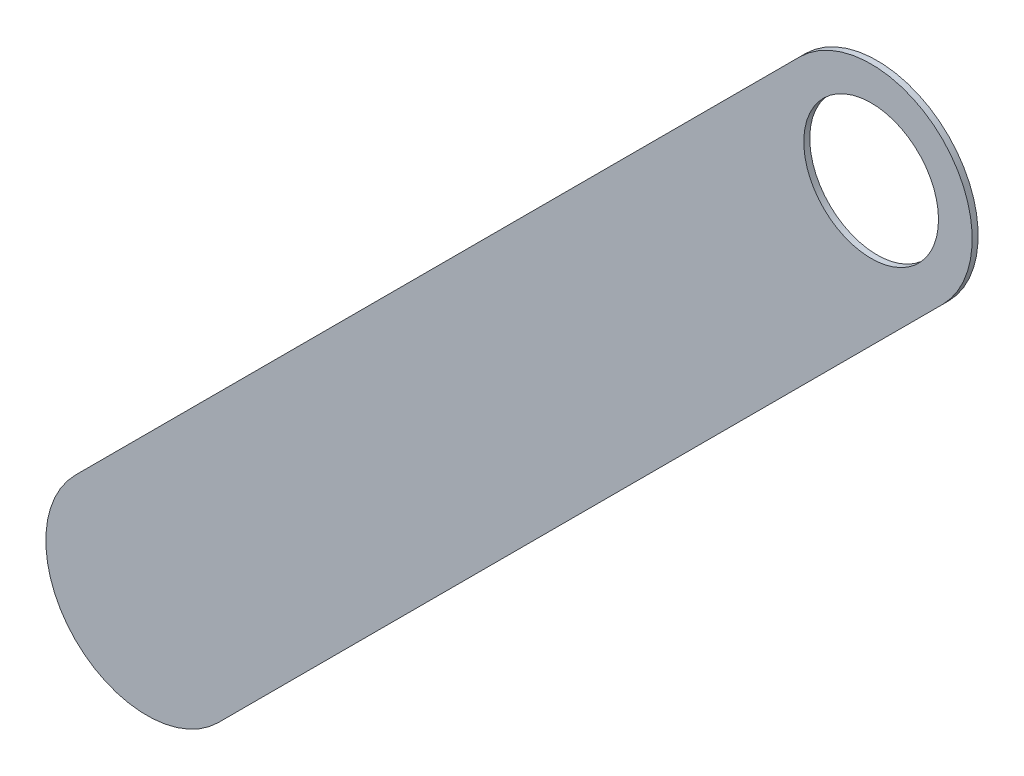
ISO-10303-21;
HEADER;
FILE_DESCRIPTION(('STEP AP214'),'2;1');
FILE_NAME('part.step','',(''),(''),'','','');
FILE_SCHEMA(('AUTOMOTIVE_DESIGN { 1 0 10303 214 1 1 1 1 }'));
ENDSEC;
DATA;
#1=APPLICATION_CONTEXT('core data for automotive mechanical design processes');
#2=APPLICATION_PROTOCOL_DEFINITION('international standard','automotive_design',2000,#1);
#3=PRODUCT_CONTEXT('',#1,'mechanical');
#4=PRODUCT('Part','Part','',(#3));
#5=PRODUCT_RELATED_PRODUCT_CATEGORY('part','',(#4));
#6=PRODUCT_DEFINITION_FORMATION('','',#4);
#7=PRODUCT_DEFINITION_CONTEXT('part definition',#1,'design');
#8=PRODUCT_DEFINITION('design','',#6,#7);
#9=PRODUCT_DEFINITION_SHAPE('','',#8);
#10=(LENGTH_UNIT() NAMED_UNIT(*) SI_UNIT(.MILLI.,.METRE.));
#11=(NAMED_UNIT(*) PLANE_ANGLE_UNIT() SI_UNIT($,.RADIAN.));
#12=(NAMED_UNIT(*) SI_UNIT($,.STERADIAN.) SOLID_ANGLE_UNIT());
#13=UNCERTAINTY_MEASURE_WITH_UNIT(LENGTH_MEASURE(1.E-05),#10,'distance_accuracy_value','');
#14=(GEOMETRIC_REPRESENTATION_CONTEXT(3) GLOBAL_UNCERTAINTY_ASSIGNED_CONTEXT((#13)) GLOBAL_UNIT_ASSIGNED_CONTEXT((#10,
#11,#12)) REPRESENTATION_CONTEXT('',''));
#15=CARTESIAN_POINT('',(0.,0.,0.));
#16=DIRECTION('',(0.,0.,1.));
#17=DIRECTION('',(1.,0.,0.));
#18=AXIS2_PLACEMENT_3D('',#15,#16,#17);
#19=CARTESIAN_POINT('',(51.00424648,70.57574658,0.));
#20=DIRECTION('',(-0.707106781186547,0.707106781186548,0.));
#21=DIRECTION('',(0.707106781186548,0.707106781186547,0.));
#22=AXIS2_PLACEMENT_3D('',#19,#20,#21);
#23=PLANE('',#22);
#24=DIRECTION('',(0.707106781186548,0.707106781186547,0.));
#25=VECTOR('',#24,1.);
#26=CARTESIAN_POINT('',(51.00424648,70.57574658,0.03556));
#27=LINE('',#26,#25);
#28=CARTESIAN_POINT('',(51.00424648,70.57574658,0.03556));
#29=VERTEX_POINT('',#28);
#30=CARTESIAN_POINT('',(55.30426328,74.87576338,0.03556));
#31=VERTEX_POINT('',#30);
#32=EDGE_CURVE('E11',#29,#31,#27,.T.);
#33=ORIENTED_EDGE('',*,*,#32,.F.);
#34=DIRECTION('',(0.,0.,1.));
#35=VECTOR('',#34,1.);
#36=CARTESIAN_POINT('',(51.00424648,70.57574658,0.));
#37=LINE('',#36,#35);
#38=CARTESIAN_POINT('',(51.00424648,70.57574658,0.));
#39=VERTEX_POINT('',#38);
#40=EDGE_CURVE('E24',#39,#29,#37,.T.);
#41=ORIENTED_EDGE('',*,*,#40,.F.);
#42=DIRECTION('',(0.707106781186548,0.707106781186547,0.));
#43=VECTOR('',#42,1.);
#44=CARTESIAN_POINT('',(51.00424648,70.57574658,0.));
#45=LINE('',#44,#43);
#46=CARTESIAN_POINT('',(55.30426328,74.87576338,0.));
#47=VERTEX_POINT('',#46);
#48=EDGE_CURVE('E96',#39,#47,#45,.T.);
#49=ORIENTED_EDGE('',*,*,#48,.T.);
#50=DIRECTION('',(0.,0.,1.));
#51=VECTOR('',#50,1.);
#52=CARTESIAN_POINT('',(55.30426328,74.87576338,0.));
#53=LINE('',#52,#51);
#54=EDGE_CURVE('E37',#47,#31,#53,.T.);
#55=ORIENTED_EDGE('',*,*,#54,.T.);
#56=EDGE_LOOP('',(#33,#41,#49,#55));
#57=FACE_BOUND('',#56,.T.);
#58=ADVANCED_FACE('F17',(#57),#23,.F.);
#59=CARTESIAN_POINT('',(50.57998266,71.0000104,0.));
#60=DIRECTION('',(0.,0.,-1.));
#61=DIRECTION('',(-0.707106781186554,0.707106781186542,0.));
#62=AXIS2_PLACEMENT_3D('',#59,#60,#61);
#63=CYLINDRICAL_SURFACE('',#62,0.599999648268219);
#64=CARTESIAN_POINT('',(50.57998266,71.0000104,0.03556));
#65=DIRECTION('',(0.,0.,1.));
#66=DIRECTION('',(-0.707106781186554,0.707106781186542,0.));
#67=AXIS2_PLACEMENT_3D('',#64,#65,#66);
#68=CIRCLE('',#67,0.599999648268219);
#69=CARTESIAN_POINT('',(50.15571884,71.42427422,0.03556));
#70=VERTEX_POINT('',#69);
#71=EDGE_CURVE('E92',#70,#29,#68,.T.);
#72=ORIENTED_EDGE('',*,*,#71,.F.);
#73=DIRECTION('',(0.,0.,1.));
#74=VECTOR('',#73,1.);
#75=CARTESIAN_POINT('',(50.15571884,71.42427422,0.));
#76=LINE('',#75,#74);
#77=CARTESIAN_POINT('',(50.15571884,71.42427422,0.));
#78=VERTEX_POINT('',#77);
#79=EDGE_CURVE('E90',#78,#70,#76,.T.);
#80=ORIENTED_EDGE('',*,*,#79,.F.);
#81=CARTESIAN_POINT('',(50.57998266,71.0000104,0.));
#82=DIRECTION('',(0.,0.,1.));
#83=DIRECTION('',(-0.707106781186554,0.707106781186542,0.));
#84=AXIS2_PLACEMENT_3D('',#81,#82,#83);
#85=CIRCLE('',#84,0.599999648268219);
#86=EDGE_CURVE('E88',#78,#39,#85,.T.);
#87=ORIENTED_EDGE('',*,*,#86,.T.);
#88=ORIENTED_EDGE('',*,*,#40,.T.);
#89=EDGE_LOOP('',(#72,#80,#87,#88));
#90=FACE_BOUND('',#89,.T.);
#91=ADVANCED_FACE('F111',(#90),#63,.T.);
#92=CARTESIAN_POINT('',(54.87999946,75.3000272,0.));
#93=DIRECTION('',(0.,0.,-1.));
#94=DIRECTION('',(0.707106781186559,-0.707106781186536,0.));
#95=AXIS2_PLACEMENT_3D('',#92,#93,#94);
#96=CYLINDRICAL_SURFACE('',#95,0.599999648268223);
#97=CARTESIAN_POINT('',(54.87999946,75.3000272,0.03556));
#98=DIRECTION('',(0.,0.,1.));
#99=DIRECTION('',(0.707106781186559,-0.707106781186536,0.));
#100=AXIS2_PLACEMENT_3D('',#97,#98,#99);
#101=CIRCLE('',#100,0.599999648268223);
#102=CARTESIAN_POINT('',(54.45573564,75.72429102,0.03556));
#103=VERTEX_POINT('',#102);
#104=EDGE_CURVE('E85',#31,#103,#101,.T.);
#105=ORIENTED_EDGE('',*,*,#104,.F.);
#106=ORIENTED_EDGE('',*,*,#54,.F.);
#107=CARTESIAN_POINT('',(54.87999946,75.3000272,0.));
#108=DIRECTION('',(0.,0.,1.));
#109=DIRECTION('',(0.707106781186559,-0.707106781186536,0.));
#110=AXIS2_PLACEMENT_3D('',#107,#108,#109);
#111=CIRCLE('',#110,0.599999648268223);
#112=CARTESIAN_POINT('',(54.45573564,75.72429102,0.));
#113=VERTEX_POINT('',#112);
#114=EDGE_CURVE('E82',#47,#113,#111,.T.);
#115=ORIENTED_EDGE('',*,*,#114,.T.);
#116=DIRECTION('',(0.,0.,1.));
#117=VECTOR('',#116,1.);
#118=CARTESIAN_POINT('',(54.45573564,75.72429102,0.));
#119=LINE('',#118,#117);
#120=EDGE_CURVE('E80',#113,#103,#119,.T.);
#121=ORIENTED_EDGE('',*,*,#120,.T.);
#122=EDGE_LOOP('',(#105,#106,#115,#121));
#123=FACE_BOUND('',#122,.T.);
#124=ADVANCED_FACE('F104',(#123),#96,.T.);
#125=CARTESIAN_POINT('',(54.45573564,75.72429102,0.));
#126=DIRECTION('',(0.707106781186548,-0.707106781186548,0.));
#127=DIRECTION('',(-0.707106781186548,-0.707106781186548,0.));
#128=AXIS2_PLACEMENT_3D('',#125,#126,#127);
#129=PLANE('',#128);
#130=DIRECTION('',(-0.707106781186548,-0.707106781186548,0.));
#131=VECTOR('',#130,1.);
#132=CARTESIAN_POINT('',(54.45573564,75.72429102,0.03556));
#133=LINE('',#132,#131);
#134=EDGE_CURVE('E77',#103,#70,#133,.T.);
#135=ORIENTED_EDGE('',*,*,#134,.F.);
#136=ORIENTED_EDGE('',*,*,#120,.F.);
#137=DIRECTION('',(-0.707106781186548,-0.707106781186548,0.));
#138=VECTOR('',#137,1.);
#139=CARTESIAN_POINT('',(54.45573564,75.72429102,0.));
#140=LINE('',#139,#138);
#141=EDGE_CURVE('E68',#113,#78,#140,.T.);
#142=ORIENTED_EDGE('',*,*,#141,.T.);
#143=ORIENTED_EDGE('',*,*,#79,.T.);
#144=EDGE_LOOP('',(#135,#136,#142,#143));
#145=FACE_BOUND('',#144,.T.);
#146=ADVANCED_FACE('F110',(#145),#129,.F.);
#147=CARTESIAN_POINT('',(54.880002,75.3000272,0.));
#148=DIRECTION('',(0.,0.,-1.));
#149=DIRECTION('',(1.,0.,0.));
#150=AXIS2_PLACEMENT_3D('',#147,#148,#149);
#151=CYLINDRICAL_SURFACE('',#150,0.3999992);
#152=DIRECTION('',(0.,0.,1.));
#153=VECTOR('',#152,1.);
#154=CARTESIAN_POINT('',(55.2800012,75.3000272,0.));
#155=LINE('',#154,#153);
#156=CARTESIAN_POINT('',(55.2800012,75.3000272,0.));
#157=VERTEX_POINT('',#156);
#158=CARTESIAN_POINT('',(55.2800012,75.3000272,0.03556));
#159=VERTEX_POINT('',#158);
#160=EDGE_CURVE('E62',#157,#159,#155,.T.);
#161=ORIENTED_EDGE('',*,*,#160,.T.);
#162=CARTESIAN_POINT('',(54.880002,75.3000272,0.03556));
#163=DIRECTION('',(0.,0.,1.));
#164=DIRECTION('',(1.,0.,0.));
#165=AXIS2_PLACEMENT_3D('',#162,#163,#164);
#166=CIRCLE('',#165,0.3999992);
#167=EDGE_CURVE('E67',#159,#159,#166,.T.);
#168=ORIENTED_EDGE('',*,*,#167,.T.);
#169=ORIENTED_EDGE('',*,*,#160,.F.);
#170=CARTESIAN_POINT('',(54.880002,75.3000272,0.));
#171=DIRECTION('',(0.,0.,1.));
#172=DIRECTION('',(1.,0.,0.));
#173=AXIS2_PLACEMENT_3D('',#170,#171,#172);
#174=CIRCLE('',#173,0.3999992);
#175=EDGE_CURVE('E65',#157,#157,#174,.T.);
#176=ORIENTED_EDGE('',*,*,#175,.F.);
#177=EDGE_LOOP('',(#161,#168,#169,#176));
#178=FACE_BOUND('',#177,.T.);
#179=ADVANCED_FACE('F64',(#178),#151,.F.);
#180=CARTESIAN_POINT('',(51.00424648,70.57574658,0.));
#181=DIRECTION('',(0.,0.,-1.));
#182=DIRECTION('',(-1.,0.,0.));
#183=AXIS2_PLACEMENT_3D('',#180,#181,#182);
#184=PLANE('',#183);
#185=ORIENTED_EDGE('',*,*,#48,.F.);
#186=ORIENTED_EDGE('',*,*,#86,.F.);
#187=ORIENTED_EDGE('',*,*,#141,.F.);
#188=ORIENTED_EDGE('',*,*,#114,.F.);
#189=EDGE_LOOP('',(#185,#186,#187,#188));
#190=FACE_BOUND('',#189,.T.);
#191=ORIENTED_EDGE('',*,*,#175,.T.);
#192=EDGE_LOOP('',(#191));
#193=FACE_BOUND('',#192,.T.);
#194=ADVANCED_FACE('F71',(#190,#193),#184,.T.);
#195=CARTESIAN_POINT('',(51.00424648,70.57574658,0.03556));
#196=DIRECTION('',(0.,0.,-1.));
#197=DIRECTION('',(-1.,0.,0.));
#198=AXIS2_PLACEMENT_3D('',#195,#196,#197);
#199=PLANE('',#198);
#200=ORIENTED_EDGE('',*,*,#134,.T.);
#201=ORIENTED_EDGE('',*,*,#71,.T.);
#202=ORIENTED_EDGE('',*,*,#32,.T.);
#203=ORIENTED_EDGE('',*,*,#104,.T.);
#204=EDGE_LOOP('',(#200,#201,#202,#203));
#205=FACE_BOUND('',#204,.T.);
#206=ORIENTED_EDGE('',*,*,#167,.F.);
#207=EDGE_LOOP('',(#206));
#208=FACE_BOUND('',#207,.T.);
#209=ADVANCED_FACE('F107',(#205,#208),#199,.F.);
#210=CLOSED_SHELL('',(#58,#91,#124,#146,#179,#194,#209));
#211=MANIFOLD_SOLID_BREP('B1',#210);
#212=ADVANCED_BREP_SHAPE_REPRESENTATION('',(#18,#211),#14);
#213=SHAPE_DEFINITION_REPRESENTATION(#9,#212);
ENDSEC;
END-ISO-10303-21;
